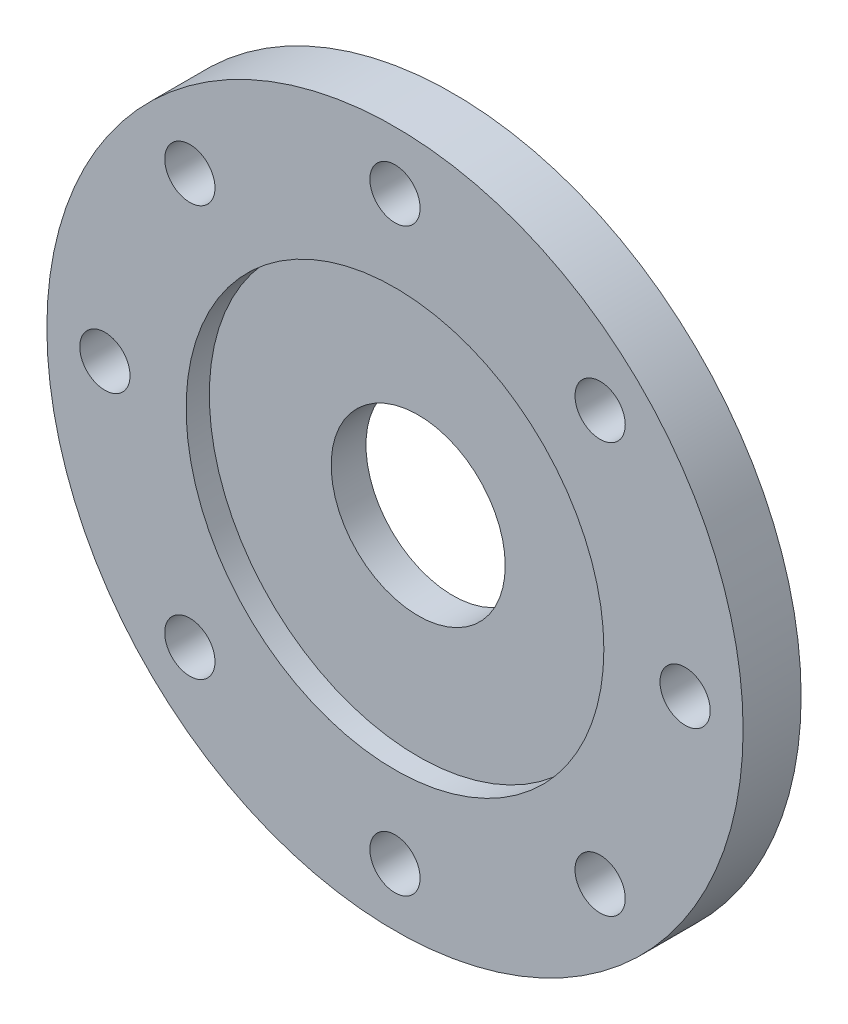
ISO-10303-21;
HEADER;
FILE_DESCRIPTION(('STEP AP214'),'2;1');
FILE_NAME('part.step','',(''),(''),'','','');
FILE_SCHEMA(('AUTOMOTIVE_DESIGN { 1 0 10303 214 1 1 1 1 }'));
ENDSEC;
DATA;
#1=APPLICATION_CONTEXT('core data for automotive mechanical design processes');
#2=APPLICATION_PROTOCOL_DEFINITION('international standard','automotive_design',2000,#1);
#3=PRODUCT_CONTEXT('',#1,'mechanical');
#4=PRODUCT('Part','Part','',(#3));
#5=PRODUCT_RELATED_PRODUCT_CATEGORY('part','',(#4));
#6=PRODUCT_DEFINITION_FORMATION('','',#4);
#7=PRODUCT_DEFINITION_CONTEXT('part definition',#1,'design');
#8=PRODUCT_DEFINITION('design','',#6,#7);
#9=PRODUCT_DEFINITION_SHAPE('','',#8);
#10=(LENGTH_UNIT() NAMED_UNIT(*) SI_UNIT(.MILLI.,.METRE.));
#11=(NAMED_UNIT(*) PLANE_ANGLE_UNIT() SI_UNIT($,.RADIAN.));
#12=(NAMED_UNIT(*) SI_UNIT($,.STERADIAN.) SOLID_ANGLE_UNIT());
#13=UNCERTAINTY_MEASURE_WITH_UNIT(LENGTH_MEASURE(1.E-05),#10,'distance_accuracy_value','');
#14=(GEOMETRIC_REPRESENTATION_CONTEXT(3) GLOBAL_UNCERTAINTY_ASSIGNED_CONTEXT((#13)) GLOBAL_UNIT_ASSIGNED_CONTEXT((#10,
#11,#12)) REPRESENTATION_CONTEXT('',''));
#15=CARTESIAN_POINT('',(0.,0.,0.));
#16=DIRECTION('',(0.,0.,1.));
#17=DIRECTION('',(1.,0.,0.));
#18=AXIS2_PLACEMENT_3D('',#15,#16,#17);
#19=CARTESIAN_POINT('',(0.,0.,3.175));
#20=DIRECTION('',(0.,0.,-1.));
#21=DIRECTION('',(-1.,0.,0.));
#22=AXIS2_PLACEMENT_3D('',#19,#20,#21);
#23=CYLINDRICAL_SURFACE('',#22,4.7625);
#24=CARTESIAN_POINT('',(0.,0.,0.));
#25=DIRECTION('',(0.,0.,1.));
#26=DIRECTION('',(1.,0.,0.));
#27=AXIS2_PLACEMENT_3D('',#24,#25,#26);
#28=CIRCLE('',#27,4.7625);
#29=CARTESIAN_POINT('',(4.7625,0.,0.));
#30=VERTEX_POINT('',#29);
#31=EDGE_CURVE('E53',#30,#30,#28,.T.);
#32=ORIENTED_EDGE('',*,*,#31,.F.);
#33=EDGE_LOOP('',(#32));
#34=FACE_BOUND('',#33,.T.);
#35=CARTESIAN_POINT('',(0.,0.,1.905));
#36=DIRECTION('',(0.,0.,1.));
#37=DIRECTION('',(1.,0.,0.));
#38=AXIS2_PLACEMENT_3D('',#35,#36,#37);
#39=CIRCLE('',#38,4.7625);
#40=CARTESIAN_POINT('',(4.7625,0.,1.905));
#41=VERTEX_POINT('',#40);
#42=EDGE_CURVE('E33',#41,#41,#39,.T.);
#43=ORIENTED_EDGE('',*,*,#42,.T.);
#44=EDGE_LOOP('',(#43));
#45=FACE_BOUND('',#44,.T.);
#46=ADVANCED_FACE('F29',(#34,#45),#23,.F.);
#47=CARTESIAN_POINT('',(0.,0.,3.175));
#48=DIRECTION('',(0.,0.,1.));
#49=DIRECTION('',(1.,0.,0.));
#50=AXIS2_PLACEMENT_3D('',#47,#48,#49);
#51=PLANE('',#50);
#52=CARTESIAN_POINT('',(0.,0.,3.175));
#53=DIRECTION('',(0.,0.,1.));
#54=DIRECTION('',(1.,0.,0.));
#55=AXIS2_PLACEMENT_3D('',#52,#53,#54);
#56=CIRCLE('',#55,11.43);
#57=CARTESIAN_POINT('',(11.43,0.,3.175));
#58=VERTEX_POINT('',#57);
#59=EDGE_CURVE('E94',#58,#58,#56,.T.);
#60=ORIENTED_EDGE('',*,*,#59,.F.);
#61=EDGE_LOOP('',(#60));
#62=FACE_BOUND('',#61,.T.);
#63=CARTESIAN_POINT('',(-15.875,1.66281895072834E-13,3.175));
#64=DIRECTION('',(0.,0.,1.));
#65=DIRECTION('',(1.,0.,0.));
#66=AXIS2_PLACEMENT_3D('',#63,#64,#65);
#67=CIRCLE('',#66,1.375);
#68=CARTESIAN_POINT('',(-14.5,1.66281895072834E-13,3.175));
#69=VERTEX_POINT('',#68);
#70=EDGE_CURVE('E80',#69,#69,#67,.T.);
#71=ORIENTED_EDGE('',*,*,#70,.F.);
#72=EDGE_LOOP('',(#71));
#73=FACE_BOUND('',#72,.T.);
#74=CARTESIAN_POINT('',(-1.10854596715223E-13,-15.875,3.175));
#75=DIRECTION('',(0.,0.,1.));
#76=DIRECTION('',(1.,0.,0.));
#77=AXIS2_PLACEMENT_3D('',#74,#75,#76);
#78=CIRCLE('',#77,1.375);
#79=CARTESIAN_POINT('',(1.37499999999989,-15.875,3.175));
#80=VERTEX_POINT('',#79);
#81=EDGE_CURVE('E68',#80,#80,#78,.T.);
#82=ORIENTED_EDGE('',*,*,#81,.F.);
#83=EDGE_LOOP('',(#82));
#84=FACE_BOUND('',#83,.T.);
#85=CARTESIAN_POINT('',(15.875,0.,3.175));
#86=DIRECTION('',(0.,0.,1.));
#87=DIRECTION('',(1.,0.,0.));
#88=AXIS2_PLACEMENT_3D('',#85,#86,#87);
#89=CIRCLE('',#88,1.375);
#90=CARTESIAN_POINT('',(17.25,0.,3.175));
#91=VERTEX_POINT('',#90);
#92=EDGE_CURVE('E58',#91,#91,#89,.T.);
#93=ORIENTED_EDGE('',*,*,#92,.F.);
#94=EDGE_LOOP('',(#93));
#95=FACE_BOUND('',#94,.T.);
#96=CARTESIAN_POINT('',(11.2253201513365,11.2253201513364,3.175));
#97=DIRECTION('',(0.,0.,1.));
#98=DIRECTION('',(1.,0.,0.));
#99=AXIS2_PLACEMENT_3D('',#96,#97,#98);
#100=CIRCLE('',#99,1.375);
#101=CARTESIAN_POINT('',(12.6003201513365,11.2253201513364,3.175));
#102=VERTEX_POINT('',#101);
#103=EDGE_CURVE('E47',#102,#102,#100,.T.);
#104=ORIENTED_EDGE('',*,*,#103,.F.);
#105=EDGE_LOOP('',(#104));
#106=FACE_BOUND('',#105,.T.);
#107=CARTESIAN_POINT('',(0.,0.,3.175));
#108=DIRECTION('',(0.,0.,1.));
#109=DIRECTION('',(1.,0.,0.));
#110=AXIS2_PLACEMENT_3D('',#107,#108,#109);
#111=CIRCLE('',#110,19.05);
#112=CARTESIAN_POINT('',(19.05,0.,3.175));
#113=VERTEX_POINT('',#112);
#114=EDGE_CURVE('E10',#113,#113,#111,.T.);
#115=ORIENTED_EDGE('',*,*,#114,.T.);
#116=EDGE_LOOP('',(#115));
#117=FACE_BOUND('',#116,.T.);
#118=CARTESIAN_POINT('',(0.,15.875,3.175));
#119=DIRECTION('',(0.,0.,1.));
#120=DIRECTION('',(1.,0.,0.));
#121=AXIS2_PLACEMENT_3D('',#118,#119,#120);
#122=CIRCLE('',#121,1.375);
#123=CARTESIAN_POINT('',(1.375,15.875,3.175));
#124=VERTEX_POINT('',#123);
#125=EDGE_CURVE('E42',#124,#124,#122,.T.);
#126=ORIENTED_EDGE('',*,*,#125,.F.);
#127=EDGE_LOOP('',(#126));
#128=FACE_BOUND('',#127,.T.);
#129=CARTESIAN_POINT('',(11.2253201513364,-11.2253201513365,3.175));
#130=DIRECTION('',(0.,0.,1.));
#131=DIRECTION('',(1.,0.,0.));
#132=AXIS2_PLACEMENT_3D('',#129,#130,#131);
#133=CIRCLE('',#132,1.375);
#134=CARTESIAN_POINT('',(12.6003201513364,-11.2253201513365,3.175));
#135=VERTEX_POINT('',#134);
#136=EDGE_CURVE('E62',#135,#135,#133,.T.);
#137=ORIENTED_EDGE('',*,*,#136,.F.);
#138=EDGE_LOOP('',(#137));
#139=FACE_BOUND('',#138,.T.);
#140=CARTESIAN_POINT('',(-11.2253201513365,-11.2253201513363,3.175));
#141=DIRECTION('',(0.,0.,1.));
#142=DIRECTION('',(1.,0.,0.));
#143=AXIS2_PLACEMENT_3D('',#140,#141,#142);
#144=CIRCLE('',#143,1.375);
#145=CARTESIAN_POINT('',(-9.85032015133654,-11.2253201513363,3.175));
#146=VERTEX_POINT('',#145);
#147=EDGE_CURVE('E74',#146,#146,#144,.T.);
#148=ORIENTED_EDGE('',*,*,#147,.F.);
#149=EDGE_LOOP('',(#148));
#150=FACE_BOUND('',#149,.T.);
#151=CARTESIAN_POINT('',(-11.2253201513363,11.2253201513366,3.175));
#152=DIRECTION('',(0.,0.,1.));
#153=DIRECTION('',(1.,0.,0.));
#154=AXIS2_PLACEMENT_3D('',#151,#152,#153);
#155=CIRCLE('',#154,1.375);
#156=CARTESIAN_POINT('',(-9.85032015133631,11.2253201513366,3.175));
#157=VERTEX_POINT('',#156);
#158=EDGE_CURVE('E86',#157,#157,#155,.T.);
#159=ORIENTED_EDGE('',*,*,#158,.F.);
#160=EDGE_LOOP('',(#159));
#161=FACE_BOUND('',#160,.T.);
#162=ADVANCED_FACE('F116',(#62,#73,#84,#95,#106,#117,#128,#139,#150,#161),#51,.T.);
#163=CARTESIAN_POINT('',(0.,0.,0.));
#164=DIRECTION('',(0.,0.,1.));
#165=DIRECTION('',(1.,0.,0.));
#166=AXIS2_PLACEMENT_3D('',#163,#164,#165);
#167=PLANE('',#166);
#168=CARTESIAN_POINT('',(-15.875,1.66281895072834E-13,0.));
#169=DIRECTION('',(0.,0.,1.));
#170=DIRECTION('',(1.,0.,0.));
#171=AXIS2_PLACEMENT_3D('',#168,#169,#170);
#172=CIRCLE('',#171,1.375);
#173=CARTESIAN_POINT('',(-14.5,1.66281895072834E-13,0.));
#174=VERTEX_POINT('',#173);
#175=EDGE_CURVE('E83',#174,#174,#172,.T.);
#176=ORIENTED_EDGE('',*,*,#175,.T.);
#177=EDGE_LOOP('',(#176));
#178=FACE_BOUND('',#177,.T.);
#179=CARTESIAN_POINT('',(-1.10854596715223E-13,-15.875,0.));
#180=DIRECTION('',(0.,0.,1.));
#181=DIRECTION('',(1.,0.,0.));
#182=AXIS2_PLACEMENT_3D('',#179,#180,#181);
#183=CIRCLE('',#182,1.375);
#184=CARTESIAN_POINT('',(1.37499999999989,-15.875,0.));
#185=VERTEX_POINT('',#184);
#186=EDGE_CURVE('E71',#185,#185,#183,.T.);
#187=ORIENTED_EDGE('',*,*,#186,.T.);
#188=EDGE_LOOP('',(#187));
#189=FACE_BOUND('',#188,.T.);
#190=CARTESIAN_POINT('',(15.875,0.,0.));
#191=DIRECTION('',(0.,0.,1.));
#192=DIRECTION('',(1.,0.,0.));
#193=AXIS2_PLACEMENT_3D('',#190,#191,#192);
#194=CIRCLE('',#193,1.375);
#195=CARTESIAN_POINT('',(17.25,0.,0.));
#196=VERTEX_POINT('',#195);
#197=EDGE_CURVE('E59',#196,#196,#194,.T.);
#198=ORIENTED_EDGE('',*,*,#197,.T.);
#199=EDGE_LOOP('',(#198));
#200=FACE_BOUND('',#199,.T.);
#201=CARTESIAN_POINT('',(11.2253201513365,11.2253201513364,0.));
#202=DIRECTION('',(0.,0.,1.));
#203=DIRECTION('',(1.,0.,0.));
#204=AXIS2_PLACEMENT_3D('',#201,#202,#203);
#205=CIRCLE('',#204,1.375);
#206=CARTESIAN_POINT('',(12.6003201513365,11.2253201513364,0.));
#207=VERTEX_POINT('',#206);
#208=EDGE_CURVE('E50',#207,#207,#205,.T.);
#209=ORIENTED_EDGE('',*,*,#208,.T.);
#210=EDGE_LOOP('',(#209));
#211=FACE_BOUND('',#210,.T.);
#212=CARTESIAN_POINT('',(0.,0.,0.));
#213=DIRECTION('',(0.,0.,1.));
#214=DIRECTION('',(1.,0.,0.));
#215=AXIS2_PLACEMENT_3D('',#212,#213,#214);
#216=CIRCLE('',#215,19.05);
#217=CARTESIAN_POINT('',(19.05,0.,0.));
#218=VERTEX_POINT('',#217);
#219=EDGE_CURVE('E37',#218,#218,#216,.T.);
#220=ORIENTED_EDGE('',*,*,#219,.F.);
#221=EDGE_LOOP('',(#220));
#222=FACE_BOUND('',#221,.T.);
#223=CARTESIAN_POINT('',(0.,15.875,0.));
#224=DIRECTION('',(0.,0.,1.));
#225=DIRECTION('',(1.,0.,0.));
#226=AXIS2_PLACEMENT_3D('',#223,#224,#225);
#227=CIRCLE('',#226,1.375);
#228=CARTESIAN_POINT('',(1.375,15.875,0.));
#229=VERTEX_POINT('',#228);
#230=EDGE_CURVE('E44',#229,#229,#227,.T.);
#231=ORIENTED_EDGE('',*,*,#230,.T.);
#232=EDGE_LOOP('',(#231));
#233=FACE_BOUND('',#232,.T.);
#234=ORIENTED_EDGE('',*,*,#31,.T.);
#235=EDGE_LOOP('',(#234));
#236=FACE_BOUND('',#235,.T.);
#237=CARTESIAN_POINT('',(11.2253201513364,-11.2253201513365,0.));
#238=DIRECTION('',(0.,0.,1.));
#239=DIRECTION('',(1.,0.,0.));
#240=AXIS2_PLACEMENT_3D('',#237,#238,#239);
#241=CIRCLE('',#240,1.375);
#242=CARTESIAN_POINT('',(12.6003201513364,-11.2253201513365,0.));
#243=VERTEX_POINT('',#242);
#244=EDGE_CURVE('E65',#243,#243,#241,.T.);
#245=ORIENTED_EDGE('',*,*,#244,.T.);
#246=EDGE_LOOP('',(#245));
#247=FACE_BOUND('',#246,.T.);
#248=CARTESIAN_POINT('',(-11.2253201513365,-11.2253201513363,0.));
#249=DIRECTION('',(0.,0.,1.));
#250=DIRECTION('',(1.,0.,0.));
#251=AXIS2_PLACEMENT_3D('',#248,#249,#250);
#252=CIRCLE('',#251,1.375);
#253=CARTESIAN_POINT('',(-9.85032015133654,-11.2253201513363,0.));
#254=VERTEX_POINT('',#253);
#255=EDGE_CURVE('E77',#254,#254,#252,.T.);
#256=ORIENTED_EDGE('',*,*,#255,.T.);
#257=EDGE_LOOP('',(#256));
#258=FACE_BOUND('',#257,.T.);
#259=CARTESIAN_POINT('',(-11.2253201513363,11.2253201513366,0.));
#260=DIRECTION('',(0.,0.,1.));
#261=DIRECTION('',(1.,0.,0.));
#262=AXIS2_PLACEMENT_3D('',#259,#260,#261);
#263=CIRCLE('',#262,1.375);
#264=CARTESIAN_POINT('',(-9.85032015133631,11.2253201513366,0.));
#265=VERTEX_POINT('',#264);
#266=EDGE_CURVE('E89',#265,#265,#263,.T.);
#267=ORIENTED_EDGE('',*,*,#266,.T.);
#268=EDGE_LOOP('',(#267));
#269=FACE_BOUND('',#268,.T.);
#270=ADVANCED_FACE('F122',(#178,#189,#200,#211,#222,#233,#236,#247,#258,#269),#167,.F.);
#271=CARTESIAN_POINT('',(0.,0.,3.175));
#272=DIRECTION('',(0.,0.,-1.));
#273=DIRECTION('',(-1.,0.,0.));
#274=AXIS2_PLACEMENT_3D('',#271,#272,#273);
#275=CYLINDRICAL_SURFACE('',#274,19.05);
#276=ORIENTED_EDGE('',*,*,#114,.F.);
#277=EDGE_LOOP('',(#276));
#278=FACE_BOUND('',#277,.T.);
#279=ORIENTED_EDGE('',*,*,#219,.T.);
#280=EDGE_LOOP('',(#279));
#281=FACE_BOUND('',#280,.T.);
#282=ADVANCED_FACE('F31',(#278,#281),#275,.T.);
#283=CARTESIAN_POINT('',(0.,15.875,3.175));
#284=DIRECTION('',(0.,0.,-1.));
#285=DIRECTION('',(-1.,0.,0.));
#286=AXIS2_PLACEMENT_3D('',#283,#284,#285);
#287=CYLINDRICAL_SURFACE('',#286,1.375);
#288=ORIENTED_EDGE('',*,*,#125,.T.);
#289=EDGE_LOOP('',(#288));
#290=FACE_BOUND('',#289,.T.);
#291=ORIENTED_EDGE('',*,*,#230,.F.);
#292=EDGE_LOOP('',(#291));
#293=FACE_BOUND('',#292,.T.);
#294=ADVANCED_FACE('F133',(#290,#293),#287,.F.);
#295=CARTESIAN_POINT('',(11.2253201513365,11.2253201513364,3.175));
#296=DIRECTION('',(0.,0.,-1.));
#297=DIRECTION('',(-1.,0.,0.));
#298=AXIS2_PLACEMENT_3D('',#295,#296,#297);
#299=CYLINDRICAL_SURFACE('',#298,1.375);
#300=ORIENTED_EDGE('',*,*,#103,.T.);
#301=EDGE_LOOP('',(#300));
#302=FACE_BOUND('',#301,.T.);
#303=ORIENTED_EDGE('',*,*,#208,.F.);
#304=EDGE_LOOP('',(#303));
#305=FACE_BOUND('',#304,.T.);
#306=ADVANCED_FACE('F130',(#302,#305),#299,.F.);
#307=CARTESIAN_POINT('',(15.875,0.,3.175));
#308=DIRECTION('',(0.,0.,-1.));
#309=DIRECTION('',(-1.,0.,0.));
#310=AXIS2_PLACEMENT_3D('',#307,#308,#309);
#311=CYLINDRICAL_SURFACE('',#310,1.375);
#312=ORIENTED_EDGE('',*,*,#92,.T.);
#313=EDGE_LOOP('',(#312));
#314=FACE_BOUND('',#313,.T.);
#315=ORIENTED_EDGE('',*,*,#197,.F.);
#316=EDGE_LOOP('',(#315));
#317=FACE_BOUND('',#316,.T.);
#318=ADVANCED_FACE('F128',(#314,#317),#311,.F.);
#319=CARTESIAN_POINT('',(11.2253201513364,-11.2253201513365,3.175));
#320=DIRECTION('',(0.,0.,-1.));
#321=DIRECTION('',(-1.,0.,0.));
#322=AXIS2_PLACEMENT_3D('',#319,#320,#321);
#323=CYLINDRICAL_SURFACE('',#322,1.375);
#324=ORIENTED_EDGE('',*,*,#136,.T.);
#325=EDGE_LOOP('',(#324));
#326=FACE_BOUND('',#325,.T.);
#327=ORIENTED_EDGE('',*,*,#244,.F.);
#328=EDGE_LOOP('',(#327));
#329=FACE_BOUND('',#328,.T.);
#330=ADVANCED_FACE('F178',(#326,#329),#323,.F.);
#331=CARTESIAN_POINT('',(-1.10854596715223E-13,-15.875,3.175));
#332=DIRECTION('',(0.,0.,-1.));
#333=DIRECTION('',(-1.,0.,0.));
#334=AXIS2_PLACEMENT_3D('',#331,#332,#333);
#335=CYLINDRICAL_SURFACE('',#334,1.375);
#336=ORIENTED_EDGE('',*,*,#81,.T.);
#337=EDGE_LOOP('',(#336));
#338=FACE_BOUND('',#337,.T.);
#339=ORIENTED_EDGE('',*,*,#186,.F.);
#340=EDGE_LOOP('',(#339));
#341=FACE_BOUND('',#340,.T.);
#342=ADVANCED_FACE('F175',(#338,#341),#335,.F.);
#343=CARTESIAN_POINT('',(-11.2253201513365,-11.2253201513363,3.175));
#344=DIRECTION('',(0.,0.,-1.));
#345=DIRECTION('',(-1.,0.,0.));
#346=AXIS2_PLACEMENT_3D('',#343,#344,#345);
#347=CYLINDRICAL_SURFACE('',#346,1.375);
#348=ORIENTED_EDGE('',*,*,#147,.T.);
#349=EDGE_LOOP('',(#348));
#350=FACE_BOUND('',#349,.T.);
#351=ORIENTED_EDGE('',*,*,#255,.F.);
#352=EDGE_LOOP('',(#351));
#353=FACE_BOUND('',#352,.T.);
#354=ADVANCED_FACE('F169',(#350,#353),#347,.F.);
#355=CARTESIAN_POINT('',(-15.875,1.66281895072834E-13,3.175));
#356=DIRECTION('',(0.,0.,-1.));
#357=DIRECTION('',(-1.,0.,0.));
#358=AXIS2_PLACEMENT_3D('',#355,#356,#357);
#359=CYLINDRICAL_SURFACE('',#358,1.375);
#360=ORIENTED_EDGE('',*,*,#70,.T.);
#361=EDGE_LOOP('',(#360));
#362=FACE_BOUND('',#361,.T.);
#363=ORIENTED_EDGE('',*,*,#175,.F.);
#364=EDGE_LOOP('',(#363));
#365=FACE_BOUND('',#364,.T.);
#366=ADVANCED_FACE('F163',(#362,#365),#359,.F.);
#367=CARTESIAN_POINT('',(-11.2253201513363,11.2253201513366,3.175));
#368=DIRECTION('',(0.,0.,-1.));
#369=DIRECTION('',(-1.,0.,0.));
#370=AXIS2_PLACEMENT_3D('',#367,#368,#369);
#371=CYLINDRICAL_SURFACE('',#370,1.375);
#372=ORIENTED_EDGE('',*,*,#158,.T.);
#373=EDGE_LOOP('',(#372));
#374=FACE_BOUND('',#373,.T.);
#375=ORIENTED_EDGE('',*,*,#266,.F.);
#376=EDGE_LOOP('',(#375));
#377=FACE_BOUND('',#376,.T.);
#378=ADVANCED_FACE('F112',(#374,#377),#371,.F.);
#379=CARTESIAN_POINT('',(0.,0.,1.905));
#380=DIRECTION('',(0.,0.,1.));
#381=DIRECTION('',(1.,0.,0.));
#382=AXIS2_PLACEMENT_3D('',#379,#380,#381);
#383=CYLINDRICAL_SURFACE('',#382,11.43);
#384=CARTESIAN_POINT('',(0.,0.,1.905));
#385=DIRECTION('',(0.,0.,1.));
#386=DIRECTION('',(1.,0.,0.));
#387=AXIS2_PLACEMENT_3D('',#384,#385,#386);
#388=CIRCLE('',#387,11.43);
#389=CARTESIAN_POINT('',(11.43,0.,1.905));
#390=VERTEX_POINT('',#389);
#391=EDGE_CURVE('E97',#390,#390,#388,.T.);
#392=ORIENTED_EDGE('',*,*,#391,.F.);
#393=EDGE_LOOP('',(#392));
#394=FACE_BOUND('',#393,.T.);
#395=ORIENTED_EDGE('',*,*,#59,.T.);
#396=EDGE_LOOP('',(#395));
#397=FACE_BOUND('',#396,.T.);
#398=ADVANCED_FACE('F107',(#394,#397),#383,.F.);
#399=CARTESIAN_POINT('',(0.,0.,1.905));
#400=DIRECTION('',(0.,0.,1.));
#401=DIRECTION('',(1.,0.,0.));
#402=AXIS2_PLACEMENT_3D('',#399,#400,#401);
#403=PLANE('',#402);
#404=ORIENTED_EDGE('',*,*,#42,.F.);
#405=EDGE_LOOP('',(#404));
#406=FACE_BOUND('',#405,.T.);
#407=ORIENTED_EDGE('',*,*,#391,.T.);
#408=EDGE_LOOP('',(#407));
#409=FACE_BOUND('',#408,.T.);
#410=ADVANCED_FACE('F105',(#406,#409),#403,.T.);
#411=CLOSED_SHELL('',(#46,#162,#270,#282,#294,#306,#318,#330,#342,#354,#366,#378,#398,#410));
#412=MANIFOLD_SOLID_BREP('B2',#411);
#413=ADVANCED_BREP_SHAPE_REPRESENTATION('',(#18,#412),#14);
#414=SHAPE_DEFINITION_REPRESENTATION(#9,#413);
ENDSEC;
END-ISO-10303-21;
